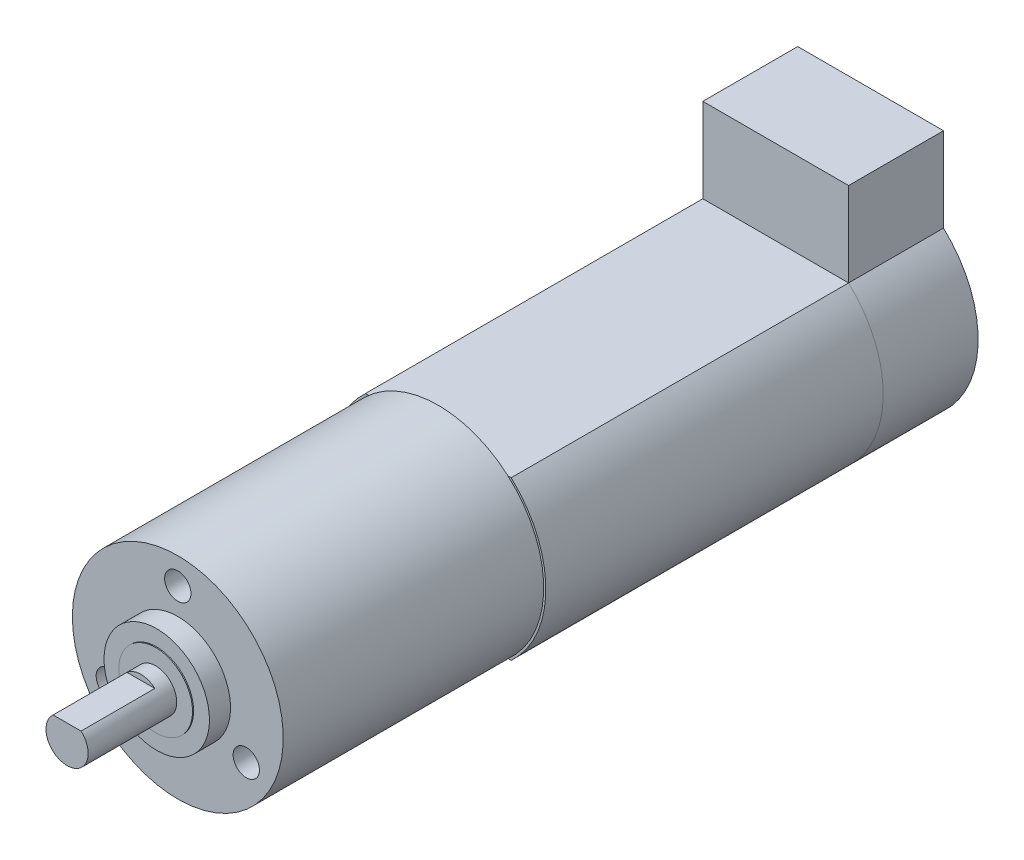
ISO-10303-21;
HEADER;
FILE_DESCRIPTION(('STEP AP214'),'2;1');
FILE_NAME('part.step','',(''),(''),'','','');
FILE_SCHEMA(('AUTOMOTIVE_DESIGN { 1 0 10303 214 1 1 1 1 }'));
ENDSEC;
DATA;
#1=APPLICATION_CONTEXT('core data for automotive mechanical design processes');
#2=APPLICATION_PROTOCOL_DEFINITION('international standard','automotive_design',2000,#1);
#3=PRODUCT_CONTEXT('',#1,'mechanical');
#4=PRODUCT('Part','Part','',(#3));
#5=PRODUCT_RELATED_PRODUCT_CATEGORY('part','',(#4));
#6=PRODUCT_DEFINITION_FORMATION('','',#4);
#7=PRODUCT_DEFINITION_CONTEXT('part definition',#1,'design');
#8=PRODUCT_DEFINITION('design','',#6,#7);
#9=PRODUCT_DEFINITION_SHAPE('','',#8);
#10=(LENGTH_UNIT() NAMED_UNIT(*) SI_UNIT(.MILLI.,.METRE.));
#11=(NAMED_UNIT(*) PLANE_ANGLE_UNIT() SI_UNIT($,.RADIAN.));
#12=(NAMED_UNIT(*) SI_UNIT($,.STERADIAN.) SOLID_ANGLE_UNIT());
#13=UNCERTAINTY_MEASURE_WITH_UNIT(LENGTH_MEASURE(1.E-05),#10,'distance_accuracy_value','');
#14=(GEOMETRIC_REPRESENTATION_CONTEXT(3) GLOBAL_UNCERTAINTY_ASSIGNED_CONTEXT((#13)) GLOBAL_UNIT_ASSIGNED_CONTEXT((#10,
#11,#12)) REPRESENTATION_CONTEXT('',''));
#15=CARTESIAN_POINT('',(0.,0.,0.));
#16=DIRECTION('',(0.,0.,1.));
#17=DIRECTION('',(1.,0.,0.));
#18=AXIS2_PLACEMENT_3D('',#15,#16,#17);
#19=CARTESIAN_POINT('',(-6.91303117308175,7.5,-76.2));
#20=DIRECTION('',(1.,0.,0.));
#21=DIRECTION('',(0.,0.,-1.));
#22=AXIS2_PLACEMENT_3D('',#19,#20,#21);
#23=PLANE('',#22);
#24=DIRECTION('',(0.,1.,0.));
#25=VECTOR('',#24,1.);
#26=CARTESIAN_POINT('',(-6.91303117308175,7.5,-67.2));
#27=LINE('',#26,#25);
#28=CARTESIAN_POINT('',(-6.91303117308175,7.5,-67.2));
#29=VERTEX_POINT('',#28);
#30=CARTESIAN_POINT('',(-6.91303117308175,15.5,-67.2));
#31=VERTEX_POINT('',#30);
#32=EDGE_CURVE('E135',#29,#31,#27,.T.);
#33=ORIENTED_EDGE('',*,*,#32,.T.);
#34=DIRECTION('',(0.,0.,1.));
#35=VECTOR('',#34,1.);
#36=CARTESIAN_POINT('',(-6.91303117308175,15.5,-76.2));
#37=LINE('',#36,#35);
#38=CARTESIAN_POINT('',(-6.91303117308175,15.5,-76.2));
#39=VERTEX_POINT('',#38);
#40=EDGE_CURVE('E12',#39,#31,#37,.T.);
#41=ORIENTED_EDGE('',*,*,#40,.F.);
#42=DIRECTION('',(0.,1.,0.));
#43=VECTOR('',#42,1.);
#44=CARTESIAN_POINT('',(-6.91303117308175,7.5,-76.2));
#45=LINE('',#44,#43);
#46=CARTESIAN_POINT('',(-6.91303117308175,7.5,-76.2));
#47=VERTEX_POINT('',#46);
#48=EDGE_CURVE('E145',#47,#39,#45,.T.);
#49=ORIENTED_EDGE('',*,*,#48,.F.);
#50=DIRECTION('',(0.,0.,1.));
#51=VECTOR('',#50,1.);
#52=CARTESIAN_POINT('',(-6.91303117308175,7.5,-76.2));
#53=LINE('',#52,#51);
#54=EDGE_CURVE('E131',#47,#29,#53,.T.);
#55=ORIENTED_EDGE('',*,*,#54,.T.);
#56=EDGE_LOOP('',(#33,#41,#49,#55));
#57=FACE_BOUND('',#56,.T.);
#58=ADVANCED_FACE('F51',(#57),#23,.F.);
#59=CARTESIAN_POINT('',(6.91303117308175,15.5,-76.2));
#60=DIRECTION('',(0.,-1.,0.));
#61=DIRECTION('',(0.,0.,-1.));
#62=AXIS2_PLACEMENT_3D('',#59,#60,#61);
#63=PLANE('',#62);
#64=DIRECTION('',(1.,0.,0.));
#65=VECTOR('',#64,1.);
#66=CARTESIAN_POINT('',(6.91303117308175,15.5,-67.2));
#67=LINE('',#66,#65);
#68=CARTESIAN_POINT('',(6.91303117308175,15.5,-67.2));
#69=VERTEX_POINT('',#68);
#70=EDGE_CURVE('E138',#31,#69,#67,.T.);
#71=ORIENTED_EDGE('',*,*,#70,.T.);
#72=DIRECTION('',(0.,0.,1.));
#73=VECTOR('',#72,1.);
#74=CARTESIAN_POINT('',(6.91303117308175,15.5,-76.2));
#75=LINE('',#74,#73);
#76=CARTESIAN_POINT('',(6.91303117308175,15.5,-76.2));
#77=VERTEX_POINT('',#76);
#78=EDGE_CURVE('E59',#77,#69,#75,.T.);
#79=ORIENTED_EDGE('',*,*,#78,.F.);
#80=DIRECTION('',(1.,0.,0.));
#81=VECTOR('',#80,1.);
#82=CARTESIAN_POINT('',(6.91303117308175,15.5,-76.2));
#83=LINE('',#82,#81);
#84=EDGE_CURVE('E104',#39,#77,#83,.T.);
#85=ORIENTED_EDGE('',*,*,#84,.F.);
#86=ORIENTED_EDGE('',*,*,#40,.T.);
#87=EDGE_LOOP('',(#71,#79,#85,#86));
#88=FACE_BOUND('',#87,.T.);
#89=ADVANCED_FACE('F169',(#88),#63,.F.);
#90=CARTESIAN_POINT('',(6.91303117308175,7.5,-76.2));
#91=DIRECTION('',(-1.,0.,0.));
#92=DIRECTION('',(0.,0.,1.));
#93=AXIS2_PLACEMENT_3D('',#90,#91,#92);
#94=PLANE('',#93);
#95=DIRECTION('',(0.,-1.,0.));
#96=VECTOR('',#95,1.);
#97=CARTESIAN_POINT('',(6.91303117308175,7.5,-67.2));
#98=LINE('',#97,#96);
#99=CARTESIAN_POINT('',(6.91303117308175,7.5,-67.2));
#100=VERTEX_POINT('',#99);
#101=EDGE_CURVE('E140',#69,#100,#98,.T.);
#102=ORIENTED_EDGE('',*,*,#101,.T.);
#103=DIRECTION('',(0.,0.,1.));
#104=VECTOR('',#103,1.);
#105=CARTESIAN_POINT('',(6.91303117308175,7.5,-76.2));
#106=LINE('',#105,#104);
#107=CARTESIAN_POINT('',(6.91303117308175,7.5,-76.2));
#108=VERTEX_POINT('',#107);
#109=EDGE_CURVE('E126',#108,#100,#106,.T.);
#110=ORIENTED_EDGE('',*,*,#109,.F.);
#111=DIRECTION('',(0.,-1.,0.));
#112=VECTOR('',#111,1.);
#113=CARTESIAN_POINT('',(6.91303117308175,7.5,-76.2));
#114=LINE('',#113,#112);
#115=EDGE_CURVE('E117',#77,#108,#114,.T.);
#116=ORIENTED_EDGE('',*,*,#115,.F.);
#117=ORIENTED_EDGE('',*,*,#78,.T.);
#118=EDGE_LOOP('',(#102,#110,#116,#117));
#119=FACE_BOUND('',#118,.T.);
#120=ADVANCED_FACE('F151',(#119),#94,.F.);
#121=CARTESIAN_POINT('',(0.,0.,-76.2));
#122=DIRECTION('',(0.,0.,1.));
#123=DIRECTION('',(1.,0.,0.));
#124=AXIS2_PLACEMENT_3D('',#121,#122,#123);
#125=CYLINDRICAL_SURFACE('',#124,10.2);
#126=CARTESIAN_POINT('',(0.,0.,-67.2));
#127=DIRECTION('',(0.,0.,-1.));
#128=DIRECTION('',(-1.,0.,0.));
#129=AXIS2_PLACEMENT_3D('',#126,#127,#128);
#130=CIRCLE('',#129,10.2);
#131=CARTESIAN_POINT('',(6.91303117308175,-7.5,-67.2));
#132=VERTEX_POINT('',#131);
#133=EDGE_CURVE('E125',#100,#132,#130,.T.);
#134=ORIENTED_EDGE('',*,*,#133,.T.);
#135=DIRECTION('',(0.,0.,1.));
#136=VECTOR('',#135,1.);
#137=CARTESIAN_POINT('',(6.91303117308175,-7.5,-76.2));
#138=LINE('',#137,#136);
#139=CARTESIAN_POINT('',(6.91303117308175,-7.5,-76.2));
#140=VERTEX_POINT('',#139);
#141=EDGE_CURVE('E122',#140,#132,#138,.T.);
#142=ORIENTED_EDGE('',*,*,#141,.F.);
#143=CARTESIAN_POINT('',(0.,0.,-76.2));
#144=DIRECTION('',(0.,0.,-1.));
#145=DIRECTION('',(-1.,0.,0.));
#146=AXIS2_PLACEMENT_3D('',#143,#144,#145);
#147=CIRCLE('',#146,10.2);
#148=EDGE_CURVE('E111',#108,#140,#147,.T.);
#149=ORIENTED_EDGE('',*,*,#148,.F.);
#150=ORIENTED_EDGE('',*,*,#109,.T.);
#151=EDGE_LOOP('',(#134,#142,#149,#150));
#152=FACE_BOUND('',#151,.T.);
#153=ADVANCED_FACE('F123',(#152),#125,.T.);
#154=CARTESIAN_POINT('',(6.91303117308175,-7.5,-76.2));
#155=DIRECTION('',(0.,1.,0.));
#156=DIRECTION('',(-1.,0.,0.));
#157=AXIS2_PLACEMENT_3D('',#154,#155,#156);
#158=PLANE('',#157);
#159=DIRECTION('',(-1.,0.,0.));
#160=VECTOR('',#159,1.);
#161=CARTESIAN_POINT('',(6.91303117308175,-7.5,-67.2));
#162=LINE('',#161,#160);
#163=CARTESIAN_POINT('',(-6.91303117308175,-7.5,-67.2));
#164=VERTEX_POINT('',#163);
#165=EDGE_CURVE('E90',#132,#164,#162,.T.);
#166=ORIENTED_EDGE('',*,*,#165,.T.);
#167=DIRECTION('',(0.,0.,1.));
#168=VECTOR('',#167,1.);
#169=CARTESIAN_POINT('',(-6.91303117308175,-7.5,-76.2));
#170=LINE('',#169,#168);
#171=CARTESIAN_POINT('',(-6.91303117308175,-7.5,-76.2));
#172=VERTEX_POINT('',#171);
#173=EDGE_CURVE('E127',#172,#164,#170,.T.);
#174=ORIENTED_EDGE('',*,*,#173,.F.);
#175=DIRECTION('',(-1.,0.,0.));
#176=VECTOR('',#175,1.);
#177=CARTESIAN_POINT('',(6.91303117308175,-7.5,-76.2));
#178=LINE('',#177,#176);
#179=EDGE_CURVE('E115',#140,#172,#178,.T.);
#180=ORIENTED_EDGE('',*,*,#179,.F.);
#181=ORIENTED_EDGE('',*,*,#141,.T.);
#182=EDGE_LOOP('',(#166,#174,#180,#181));
#183=FACE_BOUND('',#182,.T.);
#184=ADVANCED_FACE('F129',(#183),#158,.F.);
#185=CARTESIAN_POINT('',(0.,0.,-76.2));
#186=DIRECTION('',(0.,0.,1.));
#187=DIRECTION('',(1.,0.,0.));
#188=AXIS2_PLACEMENT_3D('',#185,#186,#187);
#189=CYLINDRICAL_SURFACE('',#188,10.2);
#190=CARTESIAN_POINT('',(0.,0.,-67.2));
#191=DIRECTION('',(0.,0.,-1.));
#192=DIRECTION('',(-1.,0.,0.));
#193=AXIS2_PLACEMENT_3D('',#190,#191,#192);
#194=CIRCLE('',#193,10.2);
#195=EDGE_CURVE('E96',#164,#29,#194,.T.);
#196=ORIENTED_EDGE('',*,*,#195,.T.);
#197=ORIENTED_EDGE('',*,*,#54,.F.);
#198=CARTESIAN_POINT('',(0.,0.,-76.2));
#199=DIRECTION('',(0.,0.,-1.));
#200=DIRECTION('',(-1.,0.,0.));
#201=AXIS2_PLACEMENT_3D('',#198,#199,#200);
#202=CIRCLE('',#201,10.2);
#203=EDGE_CURVE('E67',#172,#47,#202,.T.);
#204=ORIENTED_EDGE('',*,*,#203,.F.);
#205=ORIENTED_EDGE('',*,*,#173,.T.);
#206=EDGE_LOOP('',(#196,#197,#204,#205));
#207=FACE_BOUND('',#206,.T.);
#208=ADVANCED_FACE('F158',(#207),#189,.T.);
#209=CARTESIAN_POINT('',(0.,0.,-76.2));
#210=DIRECTION('',(0.,0.,-1.));
#211=DIRECTION('',(-1.,0.,0.));
#212=AXIS2_PLACEMENT_3D('',#209,#210,#211);
#213=PLANE('',#212);
#214=ORIENTED_EDGE('',*,*,#48,.T.);
#215=ORIENTED_EDGE('',*,*,#84,.T.);
#216=ORIENTED_EDGE('',*,*,#115,.T.);
#217=ORIENTED_EDGE('',*,*,#148,.T.);
#218=ORIENTED_EDGE('',*,*,#179,.T.);
#219=ORIENTED_EDGE('',*,*,#203,.T.);
#220=EDGE_LOOP('',(#214,#215,#216,#217,#218,#219));
#221=FACE_BOUND('',#220,.T.);
#222=ADVANCED_FACE('F113',(#221),#213,.T.);
#223=CARTESIAN_POINT('',(0.,0.,-67.2));
#224=DIRECTION('',(0.,0.,-1.));
#225=DIRECTION('',(-1.,0.,0.));
#226=AXIS2_PLACEMENT_3D('',#223,#224,#225);
#227=PLANE('',#226);
#228=ORIENTED_EDGE('',*,*,#32,.F.);
#229=ORIENTED_EDGE('',*,*,#195,.F.);
#230=ORIENTED_EDGE('',*,*,#165,.F.);
#231=ORIENTED_EDGE('',*,*,#133,.F.);
#232=ORIENTED_EDGE('',*,*,#101,.F.);
#233=ORIENTED_EDGE('',*,*,#70,.F.);
#234=EDGE_LOOP('',(#228,#229,#230,#231,#232,#233));
#235=FACE_BOUND('',#234,.T.);
#236=ADVANCED_FACE('F154',(#235),#227,.F.);
#237=CLOSED_SHELL('',(#58,#89,#120,#153,#184,#208,#222,#236));
#238=MANIFOLD_SOLID_BREP('B2',#237);
#239=CARTESIAN_POINT('',(0.,0.,-67.2));
#240=DIRECTION('',(0.,0.,1.));
#241=DIRECTION('',(1.,0.,0.));
#242=AXIS2_PLACEMENT_3D('',#239,#240,#241);
#243=CYLINDRICAL_SURFACE('',#242,10.2);
#244=CARTESIAN_POINT('',(0.,0.,-35.2));
#245=DIRECTION('',(0.,0.,-1.));
#246=DIRECTION('',(-1.,0.,0.));
#247=AXIS2_PLACEMENT_3D('',#244,#245,#246);
#248=CIRCLE('',#247,10.2);
#249=CARTESIAN_POINT('',(6.91303117308175,7.5,-35.2));
#250=VERTEX_POINT('',#249);
#251=CARTESIAN_POINT('',(6.91303117308175,-7.5,-35.2));
#252=VERTEX_POINT('',#251);
#253=EDGE_CURVE('E297',#250,#252,#248,.T.);
#254=ORIENTED_EDGE('',*,*,#253,.T.);
#255=DIRECTION('',(0.,0.,1.));
#256=VECTOR('',#255,1.);
#257=CARTESIAN_POINT('',(6.91303117308175,-7.5,-67.2));
#258=LINE('',#257,#256);
#259=CARTESIAN_POINT('',(6.91303117308175,-7.5,-67.2));
#260=VERTEX_POINT('',#259);
#261=EDGE_CURVE('E49',#260,#252,#258,.T.);
#262=ORIENTED_EDGE('',*,*,#261,.F.);
#263=CARTESIAN_POINT('',(0.,0.,-67.2));
#264=DIRECTION('',(0.,0.,-1.));
#265=DIRECTION('',(-1.,0.,0.));
#266=AXIS2_PLACEMENT_3D('',#263,#264,#265);
#267=CIRCLE('',#266,10.2);
#268=CARTESIAN_POINT('',(6.91303117308175,7.5,-67.2));
#269=VERTEX_POINT('',#268);
#270=EDGE_CURVE('E285',#269,#260,#267,.T.);
#271=ORIENTED_EDGE('',*,*,#270,.F.);
#272=DIRECTION('',(0.,0.,1.));
#273=VECTOR('',#272,1.);
#274=CARTESIAN_POINT('',(6.91303117308175,7.5,-67.2));
#275=LINE('',#274,#273);
#276=EDGE_CURVE('E293',#269,#250,#275,.T.);
#277=ORIENTED_EDGE('',*,*,#276,.T.);
#278=EDGE_LOOP('',(#254,#262,#271,#277));
#279=FACE_BOUND('',#278,.T.);
#280=ADVANCED_FACE('F234',(#279),#243,.T.);
#281=CARTESIAN_POINT('',(6.91303117308175,-7.5,-67.2));
#282=DIRECTION('',(0.,1.,0.));
#283=DIRECTION('',(0.,0.,1.));
#284=AXIS2_PLACEMENT_3D('',#281,#282,#283);
#285=PLANE('',#284);
#286=DIRECTION('',(-1.,0.,0.));
#287=VECTOR('',#286,1.);
#288=CARTESIAN_POINT('',(6.91303117308175,-7.5,-35.2));
#289=LINE('',#288,#287);
#290=CARTESIAN_POINT('',(-6.91303117308175,-7.5,-35.2));
#291=VERTEX_POINT('',#290);
#292=EDGE_CURVE('E289',#252,#291,#289,.T.);
#293=ORIENTED_EDGE('',*,*,#292,.T.);
#294=DIRECTION('',(0.,0.,1.));
#295=VECTOR('',#294,1.);
#296=CARTESIAN_POINT('',(-6.91303117308175,-7.5,-67.2));
#297=LINE('',#296,#295);
#298=CARTESIAN_POINT('',(-6.91303117308175,-7.5,-67.2));
#299=VERTEX_POINT('',#298);
#300=EDGE_CURVE('E242',#299,#291,#297,.T.);
#301=ORIENTED_EDGE('',*,*,#300,.F.);
#302=DIRECTION('',(-1.,0.,0.));
#303=VECTOR('',#302,1.);
#304=CARTESIAN_POINT('',(6.91303117308175,-7.5,-67.2));
#305=LINE('',#304,#303);
#306=EDGE_CURVE('E280',#260,#299,#305,.T.);
#307=ORIENTED_EDGE('',*,*,#306,.F.);
#308=ORIENTED_EDGE('',*,*,#261,.T.);
#309=EDGE_LOOP('',(#293,#301,#307,#308));
#310=FACE_BOUND('',#309,.T.);
#311=ADVANCED_FACE('F288',(#310),#285,.F.);
#312=CARTESIAN_POINT('',(0.,0.,-67.2));
#313=DIRECTION('',(0.,0.,1.));
#314=DIRECTION('',(1.,0.,0.));
#315=AXIS2_PLACEMENT_3D('',#312,#313,#314);
#316=CYLINDRICAL_SURFACE('',#315,10.2);
#317=CARTESIAN_POINT('',(0.,0.,-35.2));
#318=DIRECTION('',(0.,0.,-1.));
#319=DIRECTION('',(-1.,0.,0.));
#320=AXIS2_PLACEMENT_3D('',#317,#318,#319);
#321=CIRCLE('',#320,10.2);
#322=CARTESIAN_POINT('',(-6.91303117308175,7.5,-35.2));
#323=VERTEX_POINT('',#322);
#324=EDGE_CURVE('E267',#291,#323,#321,.T.);
#325=ORIENTED_EDGE('',*,*,#324,.T.);
#326=DIRECTION('',(0.,0.,1.));
#327=VECTOR('',#326,1.);
#328=CARTESIAN_POINT('',(-6.91303117308175,7.5,-67.2));
#329=LINE('',#328,#327);
#330=CARTESIAN_POINT('',(-6.91303117308175,7.5,-67.2));
#331=VERTEX_POINT('',#330);
#332=EDGE_CURVE('E290',#331,#323,#329,.T.);
#333=ORIENTED_EDGE('',*,*,#332,.F.);
#334=CARTESIAN_POINT('',(0.,0.,-67.2));
#335=DIRECTION('',(0.,0.,-1.));
#336=DIRECTION('',(-1.,0.,0.));
#337=AXIS2_PLACEMENT_3D('',#334,#335,#336);
#338=CIRCLE('',#337,10.2);
#339=EDGE_CURVE('E283',#299,#331,#338,.T.);
#340=ORIENTED_EDGE('',*,*,#339,.F.);
#341=ORIENTED_EDGE('',*,*,#300,.T.);
#342=EDGE_LOOP('',(#325,#333,#340,#341));
#343=FACE_BOUND('',#342,.T.);
#344=ADVANCED_FACE('F291',(#343),#316,.T.);
#345=CARTESIAN_POINT('',(6.91303117308175,7.5,-67.2));
#346=DIRECTION('',(0.,-1.,0.));
#347=DIRECTION('',(0.,0.,-1.));
#348=AXIS2_PLACEMENT_3D('',#345,#346,#347);
#349=PLANE('',#348);
#350=DIRECTION('',(1.,0.,0.));
#351=VECTOR('',#350,1.);
#352=CARTESIAN_POINT('',(6.91303117308175,7.5,-35.2));
#353=LINE('',#352,#351);
#354=EDGE_CURVE('E273',#323,#250,#353,.T.);
#355=ORIENTED_EDGE('',*,*,#354,.T.);
#356=ORIENTED_EDGE('',*,*,#276,.F.);
#357=DIRECTION('',(1.,0.,0.));
#358=VECTOR('',#357,1.);
#359=CARTESIAN_POINT('',(6.91303117308175,7.5,-67.2));
#360=LINE('',#359,#358);
#361=EDGE_CURVE('E250',#331,#269,#360,.T.);
#362=ORIENTED_EDGE('',*,*,#361,.F.);
#363=ORIENTED_EDGE('',*,*,#332,.T.);
#364=EDGE_LOOP('',(#355,#356,#362,#363));
#365=FACE_BOUND('',#364,.T.);
#366=ADVANCED_FACE('F304',(#365),#349,.F.);
#367=CARTESIAN_POINT('',(0.,0.,-67.2));
#368=DIRECTION('',(0.,0.,-1.));
#369=DIRECTION('',(-1.,0.,0.));
#370=AXIS2_PLACEMENT_3D('',#367,#368,#369);
#371=PLANE('',#370);
#372=ORIENTED_EDGE('',*,*,#270,.T.);
#373=ORIENTED_EDGE('',*,*,#306,.T.);
#374=ORIENTED_EDGE('',*,*,#339,.T.);
#375=ORIENTED_EDGE('',*,*,#361,.T.);
#376=EDGE_LOOP('',(#372,#373,#374,#375));
#377=FACE_BOUND('',#376,.T.);
#378=ADVANCED_FACE('F281',(#377),#371,.T.);
#379=CARTESIAN_POINT('',(0.,0.,-35.2));
#380=DIRECTION('',(0.,0.,-1.));
#381=DIRECTION('',(-1.,0.,0.));
#382=AXIS2_PLACEMENT_3D('',#379,#380,#381);
#383=PLANE('',#382);
#384=ORIENTED_EDGE('',*,*,#253,.F.);
#385=ORIENTED_EDGE('',*,*,#354,.F.);
#386=ORIENTED_EDGE('',*,*,#324,.F.);
#387=ORIENTED_EDGE('',*,*,#292,.F.);
#388=EDGE_LOOP('',(#384,#385,#386,#387));
#389=FACE_BOUND('',#388,.T.);
#390=ADVANCED_FACE('F307',(#389),#383,.F.);
#391=CLOSED_SHELL('',(#280,#311,#344,#366,#378,#390));
#392=MANIFOLD_SOLID_BREP('B6',#391);
#393=CARTESIAN_POINT('',(0.,0.,-10.5));
#394=DIRECTION('',(0.,0.,1.));
#395=DIRECTION('',(1.,0.,0.));
#396=AXIS2_PLACEMENT_3D('',#393,#394,#395);
#397=CYLINDRICAL_SURFACE('',#396,5.);
#398=CARTESIAN_POINT('',(0.,0.,-10.5));
#399=DIRECTION('',(0.,0.,-1.));
#400=DIRECTION('',(-1.,0.,0.));
#401=AXIS2_PLACEMENT_3D('',#398,#399,#400);
#402=CIRCLE('',#401,5.);
#403=CARTESIAN_POINT('',(-5.,0.,-10.5));
#404=VERTEX_POINT('',#403);
#405=EDGE_CURVE('E233',#404,#404,#402,.T.);
#406=ORIENTED_EDGE('',*,*,#405,.F.);
#407=EDGE_LOOP('',(#406));
#408=FACE_BOUND('',#407,.T.);
#409=CARTESIAN_POINT('',(0.,0.,-8.5));
#410=DIRECTION('',(0.,0.,-1.));
#411=DIRECTION('',(-1.,0.,0.));
#412=AXIS2_PLACEMENT_3D('',#409,#410,#411);
#413=CIRCLE('',#412,5.);
#414=CARTESIAN_POINT('',(-5.,0.,-8.5));
#415=VERTEX_POINT('',#414);
#416=EDGE_CURVE('E369',#415,#415,#413,.T.);
#417=ORIENTED_EDGE('',*,*,#416,.T.);
#418=EDGE_LOOP('',(#417));
#419=FACE_BOUND('',#418,.T.);
#420=ADVANCED_FACE('F366',(#408,#419),#397,.T.);
#421=CARTESIAN_POINT('',(0.,0.,-8.5));
#422=DIRECTION('',(0.,0.,-1.));
#423=DIRECTION('',(-1.,0.,0.));
#424=AXIS2_PLACEMENT_3D('',#421,#422,#423);
#425=PLANE('',#424);
#426=ORIENTED_EDGE('',*,*,#416,.F.);
#427=EDGE_LOOP('',(#426));
#428=FACE_BOUND('',#427,.T.);
#429=ADVANCED_FACE('F425',(#428),#425,.F.);
#430=CARTESIAN_POINT('',(0.,0.,-35.2));
#431=DIRECTION('',(0.,0.,1.));
#432=DIRECTION('',(1.,0.,0.));
#433=AXIS2_PLACEMENT_3D('',#430,#431,#432);
#434=CYLINDRICAL_SURFACE('',#433,10.);
#435=CARTESIAN_POINT('',(0.,0.,-35.2));
#436=DIRECTION('',(0.,0.,-1.));
#437=DIRECTION('',(-1.,0.,0.));
#438=AXIS2_PLACEMENT_3D('',#435,#436,#437);
#439=CIRCLE('',#438,10.);
#440=CARTESIAN_POINT('',(-10.,0.,-35.2));
#441=VERTEX_POINT('',#440);
#442=EDGE_CURVE('E376',#441,#441,#439,.T.);
#443=ORIENTED_EDGE('',*,*,#442,.F.);
#444=EDGE_LOOP('',(#443));
#445=FACE_BOUND('',#444,.T.);
#446=CARTESIAN_POINT('',(0.,0.,-10.5));
#447=DIRECTION('',(0.,0.,-1.));
#448=DIRECTION('',(-1.,0.,0.));
#449=AXIS2_PLACEMENT_3D('',#446,#447,#448);
#450=CIRCLE('',#449,10.);
#451=CARTESIAN_POINT('',(-10.,0.,-10.5));
#452=VERTEX_POINT('',#451);
#453=EDGE_CURVE('E378',#452,#452,#450,.T.);
#454=ORIENTED_EDGE('',*,*,#453,.T.);
#455=EDGE_LOOP('',(#454));
#456=FACE_BOUND('',#455,.T.);
#457=ADVANCED_FACE('F423',(#445,#456),#434,.T.);
#458=CARTESIAN_POINT('',(0.,0.,-35.2));
#459=DIRECTION('',(0.,0.,-1.));
#460=DIRECTION('',(-1.,0.,0.));
#461=AXIS2_PLACEMENT_3D('',#458,#459,#460);
#462=PLANE('',#461);
#463=ORIENTED_EDGE('',*,*,#442,.T.);
#464=EDGE_LOOP('',(#463));
#465=FACE_BOUND('',#464,.T.);
#466=ADVANCED_FACE('F415',(#465),#462,.T.);
#467=CARTESIAN_POINT('',(0.,0.,-10.5));
#468=DIRECTION('',(0.,0.,-1.));
#469=DIRECTION('',(-1.,0.,0.));
#470=AXIS2_PLACEMENT_3D('',#467,#468,#469);
#471=PLANE('',#470);
#472=CARTESIAN_POINT('',(0.,7.5,-10.5));
#473=DIRECTION('',(0.,0.,1.));
#474=DIRECTION('',(1.,0.,0.));
#475=AXIS2_PLACEMENT_3D('',#472,#473,#474);
#476=CIRCLE('',#475,1.25);
#477=CARTESIAN_POINT('',(1.25,7.5,-10.5));
#478=VERTEX_POINT('',#477);
#479=EDGE_CURVE('E396',#478,#478,#476,.T.);
#480=ORIENTED_EDGE('',*,*,#479,.F.);
#481=EDGE_LOOP('',(#480));
#482=FACE_BOUND('',#481,.T.);
#483=CARTESIAN_POINT('',(6.4951905283833,-3.74999999999998,-10.5));
#484=DIRECTION('',(0.,0.,1.));
#485=DIRECTION('',(1.,0.,0.));
#486=AXIS2_PLACEMENT_3D('',#483,#484,#485);
#487=CIRCLE('',#486,1.25);
#488=CARTESIAN_POINT('',(7.7451905283833,-3.74999999999998,-10.5));
#489=VERTEX_POINT('',#488);
#490=EDGE_CURVE('E393',#489,#489,#487,.T.);
#491=ORIENTED_EDGE('',*,*,#490,.F.);
#492=EDGE_LOOP('',(#491));
#493=FACE_BOUND('',#492,.T.);
#494=CARTESIAN_POINT('',(-6.49519052838327,-3.75000000000003,-10.5));
#495=DIRECTION('',(0.,0.,1.));
#496=DIRECTION('',(1.,0.,0.));
#497=AXIS2_PLACEMENT_3D('',#494,#495,#496);
#498=CIRCLE('',#497,1.25);
#499=CARTESIAN_POINT('',(-5.24519052838327,-3.75000000000003,-10.5));
#500=VERTEX_POINT('',#499);
#501=EDGE_CURVE('E387',#500,#500,#498,.T.);
#502=ORIENTED_EDGE('',*,*,#501,.F.);
#503=EDGE_LOOP('',(#502));
#504=FACE_BOUND('',#503,.T.);
#505=ORIENTED_EDGE('',*,*,#405,.T.);
#506=EDGE_LOOP('',(#505));
#507=FACE_BOUND('',#506,.T.);
#508=ORIENTED_EDGE('',*,*,#453,.F.);
#509=EDGE_LOOP('',(#508));
#510=FACE_BOUND('',#509,.T.);
#511=ADVANCED_FACE('F411',(#482,#493,#504,#507,#510),#471,.F.);
#512=CARTESIAN_POINT('',(-6.49519052838327,-3.75000000000003,-15.5));
#513=DIRECTION('',(0.,0.,1.));
#514=DIRECTION('',(1.,0.,0.));
#515=AXIS2_PLACEMENT_3D('',#512,#513,#514);
#516=CYLINDRICAL_SURFACE('',#515,1.25);
#517=CARTESIAN_POINT('',(-6.49519052838327,-3.75000000000003,-15.5));
#518=DIRECTION('',(0.,0.,1.));
#519=DIRECTION('',(1.,0.,0.));
#520=AXIS2_PLACEMENT_3D('',#517,#518,#519);
#521=CIRCLE('',#520,1.25);
#522=CARTESIAN_POINT('',(-5.24519052838327,-3.75000000000003,-15.5));
#523=VERTEX_POINT('',#522);
#524=EDGE_CURVE('E384',#523,#523,#521,.T.);
#525=ORIENTED_EDGE('',*,*,#524,.F.);
#526=EDGE_LOOP('',(#525));
#527=FACE_BOUND('',#526,.T.);
#528=ORIENTED_EDGE('',*,*,#501,.T.);
#529=EDGE_LOOP('',(#528));
#530=FACE_BOUND('',#529,.T.);
#531=ADVANCED_FACE('F414',(#527,#530),#516,.F.);
#532=CARTESIAN_POINT('',(-6.49519052838327,-3.75000000000003,-15.5));
#533=DIRECTION('',(0.,0.,1.));
#534=DIRECTION('',(1.,0.,0.));
#535=AXIS2_PLACEMENT_3D('',#532,#533,#534);
#536=PLANE('',#535);
#537=ORIENTED_EDGE('',*,*,#524,.T.);
#538=EDGE_LOOP('',(#537));
#539=FACE_BOUND('',#538,.T.);
#540=ADVANCED_FACE('F473',(#539),#536,.T.);
#541=CARTESIAN_POINT('',(6.4951905283833,-3.74999999999998,-15.5));
#542=DIRECTION('',(0.,0.,1.));
#543=DIRECTION('',(1.,0.,0.));
#544=AXIS2_PLACEMENT_3D('',#541,#542,#543);
#545=CYLINDRICAL_SURFACE('',#544,1.25);
#546=CARTESIAN_POINT('',(6.4951905283833,-3.74999999999998,-15.5));
#547=DIRECTION('',(0.,0.,1.));
#548=DIRECTION('',(1.,0.,0.));
#549=AXIS2_PLACEMENT_3D('',#546,#547,#548);
#550=CIRCLE('',#549,1.25);
#551=CARTESIAN_POINT('',(7.7451905283833,-3.74999999999998,-15.5));
#552=VERTEX_POINT('',#551);
#553=EDGE_CURVE('E390',#552,#552,#550,.T.);
#554=ORIENTED_EDGE('',*,*,#553,.F.);
#555=EDGE_LOOP('',(#554));
#556=FACE_BOUND('',#555,.T.);
#557=ORIENTED_EDGE('',*,*,#490,.T.);
#558=EDGE_LOOP('',(#557));
#559=FACE_BOUND('',#558,.T.);
#560=ADVANCED_FACE('F483',(#556,#559),#545,.F.);
#561=CARTESIAN_POINT('',(6.4951905283833,-3.74999999999998,-15.5));
#562=DIRECTION('',(0.,0.,1.));
#563=DIRECTION('',(1.,0.,0.));
#564=AXIS2_PLACEMENT_3D('',#561,#562,#563);
#565=PLANE('',#564);
#566=ORIENTED_EDGE('',*,*,#553,.T.);
#567=EDGE_LOOP('',(#566));
#568=FACE_BOUND('',#567,.T.);
#569=ADVANCED_FACE('F407',(#568),#565,.T.);
#570=CARTESIAN_POINT('',(0.,7.5,-15.5));
#571=DIRECTION('',(0.,0.,1.));
#572=DIRECTION('',(1.,0.,0.));
#573=AXIS2_PLACEMENT_3D('',#570,#571,#572);
#574=CYLINDRICAL_SURFACE('',#573,1.25);
#575=CARTESIAN_POINT('',(0.,7.5,-15.5));
#576=DIRECTION('',(0.,0.,1.));
#577=DIRECTION('',(1.,0.,0.));
#578=AXIS2_PLACEMENT_3D('',#575,#576,#577);
#579=CIRCLE('',#578,1.25);
#580=CARTESIAN_POINT('',(1.25,7.5,-15.5));
#581=VERTEX_POINT('',#580);
#582=EDGE_CURVE('E381',#581,#581,#579,.T.);
#583=ORIENTED_EDGE('',*,*,#582,.F.);
#584=EDGE_LOOP('',(#583));
#585=FACE_BOUND('',#584,.T.);
#586=ORIENTED_EDGE('',*,*,#479,.T.);
#587=EDGE_LOOP('',(#586));
#588=FACE_BOUND('',#587,.T.);
#589=ADVANCED_FACE('F404',(#585,#588),#574,.F.);
#590=CARTESIAN_POINT('',(0.,7.5,-15.5));
#591=DIRECTION('',(0.,0.,1.));
#592=DIRECTION('',(1.,0.,0.));
#593=AXIS2_PLACEMENT_3D('',#590,#591,#592);
#594=PLANE('',#593);
#595=ORIENTED_EDGE('',*,*,#582,.T.);
#596=EDGE_LOOP('',(#595));
#597=FACE_BOUND('',#596,.T.);
#598=ADVANCED_FACE('F402',(#597),#594,.T.);
#599=CLOSED_SHELL('',(#420,#429,#457,#466,#511,#531,#540,#560,#569,#589,#598));
#600=MANIFOLD_SOLID_BREP('B43',#599);
#601=CARTESIAN_POINT('',(0.,0.,-7.));
#602=DIRECTION('',(0.,0.,1.));
#603=DIRECTION('',(1.,0.,0.));
#604=AXIS2_PLACEMENT_3D('',#601,#602,#603);
#605=CYLINDRICAL_SURFACE('',#604,2.);
#606=CARTESIAN_POINT('',(0.,0.,0.));
#607=DIRECTION('',(0.,0.,1.));
#608=DIRECTION('',(1.,0.,0.));
#609=AXIS2_PLACEMENT_3D('',#606,#607,#608);
#610=CIRCLE('',#609,2.);
#611=CARTESIAN_POINT('',(-1.3228756555323,1.5,0.));
#612=VERTEX_POINT('',#611);
#613=CARTESIAN_POINT('',(1.3228756555323,1.5,0.));
#614=VERTEX_POINT('',#613);
#615=EDGE_CURVE('E564',#612,#614,#610,.T.);
#616=ORIENTED_EDGE('',*,*,#615,.F.);
#617=DIRECTION('',(0.,0.,1.));
#618=VECTOR('',#617,1.);
#619=CARTESIAN_POINT('',(-1.3228756555323,1.5,-7.));
#620=LINE('',#619,#618);
#621=CARTESIAN_POINT('',(-1.3228756555323,1.5,-7.));
#622=VERTEX_POINT('',#621);
#623=EDGE_CURVE('E364',#622,#612,#620,.T.);
#624=ORIENTED_EDGE('',*,*,#623,.F.);
#625=CARTESIAN_POINT('',(0.,0.,-7.));
#626=DIRECTION('',(0.,0.,-1.));
#627=DIRECTION('',(-1.,0.,0.));
#628=AXIS2_PLACEMENT_3D('',#625,#626,#627);
#629=CIRCLE('',#628,2.);
#630=CARTESIAN_POINT('',(1.3228756555323,1.5,-7.));
#631=VERTEX_POINT('',#630);
#632=EDGE_CURVE('E540',#622,#631,#629,.T.);
#633=ORIENTED_EDGE('',*,*,#632,.T.);
#634=DIRECTION('',(0.,0.,1.));
#635=VECTOR('',#634,1.);
#636=CARTESIAN_POINT('',(1.3228756555323,1.5,-7.));
#637=LINE('',#636,#635);
#638=EDGE_CURVE('E529',#631,#614,#637,.T.);
#639=ORIENTED_EDGE('',*,*,#638,.T.);
#640=EDGE_LOOP('',(#616,#624,#633,#639));
#641=FACE_BOUND('',#640,.T.);
#642=CARTESIAN_POINT('',(0.,0.,-8.4));
#643=DIRECTION('',(0.,0.,-1.));
#644=DIRECTION('',(-1.,0.,0.));
#645=AXIS2_PLACEMENT_3D('',#642,#643,#644);
#646=CIRCLE('',#645,2.);
#647=CARTESIAN_POINT('',(-2.,0.,-8.4));
#648=VERTEX_POINT('',#647);
#649=EDGE_CURVE('E557',#648,#648,#646,.T.);
#650=ORIENTED_EDGE('',*,*,#649,.F.);
#651=EDGE_LOOP('',(#650));
#652=FACE_BOUND('',#651,.T.);
#653=ADVANCED_FACE('F526',(#641,#652),#605,.T.);
#654=CARTESIAN_POINT('',(-1.3228756555323,1.5,-7.));
#655=DIRECTION('',(0.,1.,0.));
#656=DIRECTION('',(0.,0.,1.));
#657=AXIS2_PLACEMENT_3D('',#654,#655,#656);
#658=PLANE('',#657);
#659=DIRECTION('',(-1.,0.,0.));
#660=VECTOR('',#659,1.);
#661=CARTESIAN_POINT('',(-1.3228756555323,1.5,0.));
#662=LINE('',#661,#660);
#663=EDGE_CURVE('E554',#614,#612,#662,.T.);
#664=ORIENTED_EDGE('',*,*,#663,.F.);
#665=ORIENTED_EDGE('',*,*,#638,.F.);
#666=DIRECTION('',(-1.,0.,0.));
#667=VECTOR('',#666,1.);
#668=CARTESIAN_POINT('',(-1.3228756555323,1.5,-7.));
#669=LINE('',#668,#667);
#670=EDGE_CURVE('E551',#631,#622,#669,.T.);
#671=ORIENTED_EDGE('',*,*,#670,.T.);
#672=ORIENTED_EDGE('',*,*,#623,.T.);
#673=EDGE_LOOP('',(#664,#665,#671,#672));
#674=FACE_BOUND('',#673,.T.);
#675=ADVANCED_FACE('F561',(#674),#658,.T.);
#676=CARTESIAN_POINT('',(0.,0.,0.));
#677=DIRECTION('',(0.,0.,1.));
#678=DIRECTION('',(1.,0.,0.));
#679=AXIS2_PLACEMENT_3D('',#676,#677,#678);
#680=PLANE('',#679);
#681=ORIENTED_EDGE('',*,*,#615,.T.);
#682=ORIENTED_EDGE('',*,*,#663,.T.);
#683=EDGE_LOOP('',(#681,#682));
#684=FACE_BOUND('',#683,.T.);
#685=ADVANCED_FACE('F597',(#684),#680,.T.);
#686=CARTESIAN_POINT('',(0.,0.,-7.));
#687=DIRECTION('',(0.,0.,-1.));
#688=DIRECTION('',(-1.,0.,0.));
#689=AXIS2_PLACEMENT_3D('',#686,#687,#688);
#690=PLANE('',#689);
#691=ORIENTED_EDGE('',*,*,#670,.F.);
#692=ORIENTED_EDGE('',*,*,#632,.F.);
#693=EDGE_LOOP('',(#691,#692));
#694=FACE_BOUND('',#693,.T.);
#695=ADVANCED_FACE('F552',(#694),#690,.F.);
#696=CARTESIAN_POINT('',(0.,0.,-8.5));
#697=DIRECTION('',(0.,0.,1.));
#698=DIRECTION('',(1.,0.,0.));
#699=AXIS2_PLACEMENT_3D('',#696,#697,#698);
#700=CYLINDRICAL_SURFACE('',#699,3.5);
#701=CARTESIAN_POINT('',(0.,0.,-8.5));
#702=DIRECTION('',(0.,0.,-1.));
#703=DIRECTION('',(-1.,0.,0.));
#704=AXIS2_PLACEMENT_3D('',#701,#702,#703);
#705=CIRCLE('',#704,3.5);
#706=CARTESIAN_POINT('',(-3.5,0.,-8.5));
#707=VERTEX_POINT('',#706);
#708=EDGE_CURVE('E558',#707,#707,#705,.T.);
#709=ORIENTED_EDGE('',*,*,#708,.F.);
#710=EDGE_LOOP('',(#709));
#711=FACE_BOUND('',#710,.T.);
#712=CARTESIAN_POINT('',(0.,0.,-8.4));
#713=DIRECTION('',(0.,0.,-1.));
#714=DIRECTION('',(-1.,0.,0.));
#715=AXIS2_PLACEMENT_3D('',#712,#713,#714);
#716=CIRCLE('',#715,3.5);
#717=CARTESIAN_POINT('',(-3.5,0.,-8.4));
#718=VERTEX_POINT('',#717);
#719=EDGE_CURVE('E570',#718,#718,#716,.T.);
#720=ORIENTED_EDGE('',*,*,#719,.T.);
#721=EDGE_LOOP('',(#720));
#722=FACE_BOUND('',#721,.T.);
#723=ADVANCED_FACE('F578',(#711,#722),#700,.T.);
#724=CARTESIAN_POINT('',(0.,0.,-8.5));
#725=DIRECTION('',(0.,0.,-1.));
#726=DIRECTION('',(-1.,0.,0.));
#727=AXIS2_PLACEMENT_3D('',#724,#725,#726);
#728=PLANE('',#727);
#729=ORIENTED_EDGE('',*,*,#708,.T.);
#730=EDGE_LOOP('',(#729));
#731=FACE_BOUND('',#730,.T.);
#732=ADVANCED_FACE('F576',(#731),#728,.T.);
#733=CARTESIAN_POINT('',(0.,0.,-8.4));
#734=DIRECTION('',(0.,0.,-1.));
#735=DIRECTION('',(-1.,0.,0.));
#736=AXIS2_PLACEMENT_3D('',#733,#734,#735);
#737=PLANE('',#736);
#738=ORIENTED_EDGE('',*,*,#649,.T.);
#739=EDGE_LOOP('',(#738));
#740=FACE_BOUND('',#739,.T.);
#741=ORIENTED_EDGE('',*,*,#719,.F.);
#742=EDGE_LOOP('',(#741));
#743=FACE_BOUND('',#742,.T.);
#744=ADVANCED_FACE('F584',(#740,#743),#737,.F.);
#745=CLOSED_SHELL('',(#653,#675,#685,#695,#723,#732,#744));
#746=MANIFOLD_SOLID_BREP('B228',#745);
#747=ADVANCED_BREP_SHAPE_REPRESENTATION('',(#18,#238,#392,#600,#746),#14);
#748=SHAPE_DEFINITION_REPRESENTATION(#9,#747);
ENDSEC;
END-ISO-10303-21;
